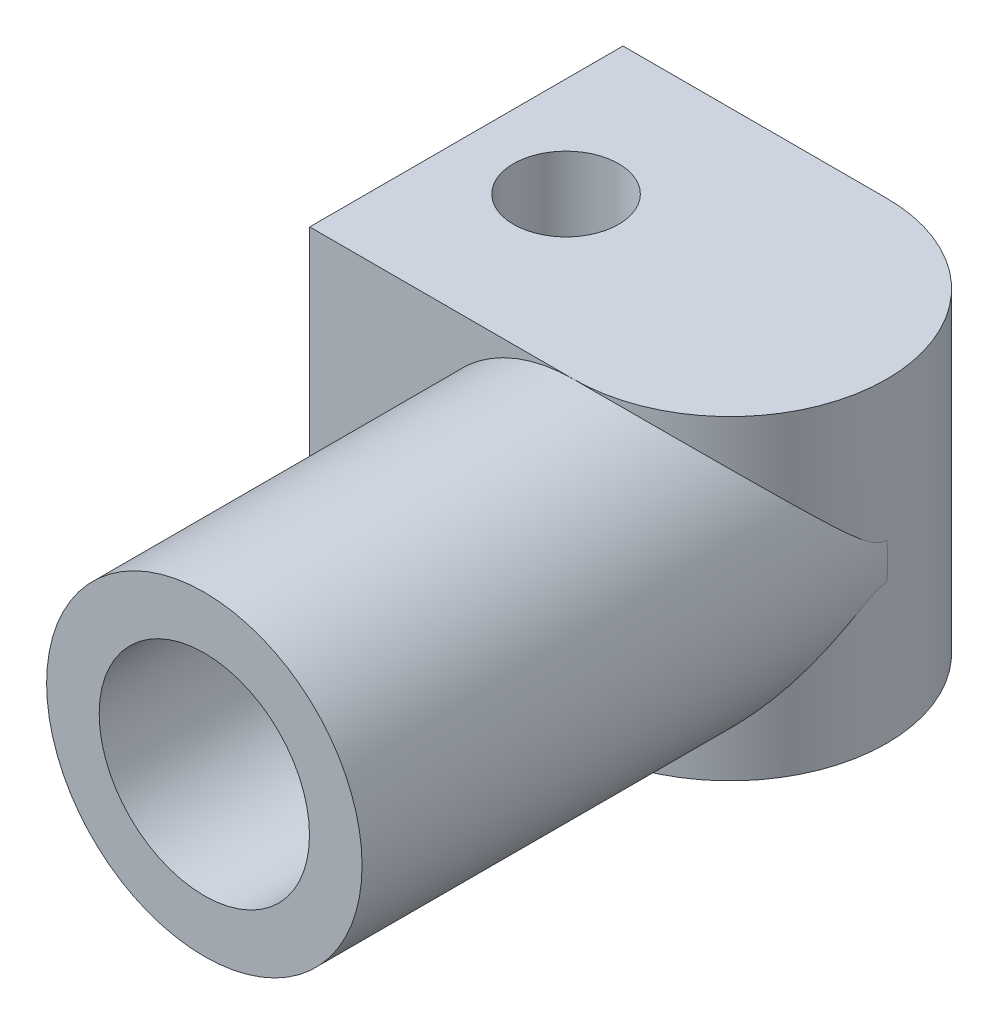
ISO-10303-21;
HEADER;
FILE_DESCRIPTION(('STEP AP214'),'2;1');
FILE_NAME('part.step','',(''),(''),'','','');
FILE_SCHEMA(('AUTOMOTIVE_DESIGN { 1 0 10303 214 1 1 1 1 }'));
ENDSEC;
DATA;
#1=APPLICATION_CONTEXT('core data for automotive mechanical design processes');
#2=APPLICATION_PROTOCOL_DEFINITION('international standard','automotive_design',2000,#1);
#3=PRODUCT_CONTEXT('',#1,'mechanical');
#4=PRODUCT('Part','Part','',(#3));
#5=PRODUCT_RELATED_PRODUCT_CATEGORY('part','',(#4));
#6=PRODUCT_DEFINITION_FORMATION('','',#4);
#7=PRODUCT_DEFINITION_CONTEXT('part definition',#1,'design');
#8=PRODUCT_DEFINITION('design','',#6,#7);
#9=PRODUCT_DEFINITION_SHAPE('','',#8);
#10=(LENGTH_UNIT() NAMED_UNIT(*) SI_UNIT(.MILLI.,.METRE.));
#11=(NAMED_UNIT(*) PLANE_ANGLE_UNIT() SI_UNIT($,.RADIAN.));
#12=(NAMED_UNIT(*) SI_UNIT($,.STERADIAN.) SOLID_ANGLE_UNIT());
#13=UNCERTAINTY_MEASURE_WITH_UNIT(LENGTH_MEASURE(1.E-05),#10,'distance_accuracy_value','');
#14=(GEOMETRIC_REPRESENTATION_CONTEXT(3) GLOBAL_UNCERTAINTY_ASSIGNED_CONTEXT((#13)) GLOBAL_UNIT_ASSIGNED_CONTEXT((#10,
#11,#12)) REPRESENTATION_CONTEXT('',''));
#15=CARTESIAN_POINT('',(0.,0.,0.));
#16=DIRECTION('',(0.,0.,1.));
#17=DIRECTION('',(1.,0.,0.));
#18=AXIS2_PLACEMENT_3D('',#15,#16,#17);
#19=CARTESIAN_POINT('',(0.,0.,0.));
#20=DIRECTION('',(0.,0.,1.));
#21=DIRECTION('',(1.,0.,0.));
#22=AXIS2_PLACEMENT_3D('',#19,#20,#21);
#23=PLANE('',#22);
#24=DIRECTION('',(0.,-1.,0.));
#25=VECTOR('',#24,1.);
#26=CARTESIAN_POINT('',(7.44939263120047,7.49999999999999,0.));
#27=LINE('',#26,#25);
#28=CARTESIAN_POINT('',(7.44939263120047,0.869798497478638,0.));
#29=VERTEX_POINT('',#28);
#30=CARTESIAN_POINT('',(7.44939263120047,-0.869798497478638,0.));
#31=VERTEX_POINT('',#30);
#32=EDGE_CURVE('E128',#29,#31,#27,.T.);
#33=ORIENTED_EDGE('',*,*,#32,.F.);
#34=CARTESIAN_POINT('',(0.,0.,0.));
#35=DIRECTION('',(0.,0.,1.));
#36=DIRECTION('',(1.,0.,0.));
#37=AXIS2_PLACEMENT_3D('',#34,#35,#36);
#38=CIRCLE('',#37,7.5);
#39=EDGE_CURVE('E150',#31,#29,#38,.T.);
#40=ORIENTED_EDGE('',*,*,#39,.F.);
#41=EDGE_LOOP('',(#33,#40));
#42=FACE_BOUND('',#41,.T.);
#43=ADVANCED_FACE('F32',(#42),#23,.F.);
#44=CARTESIAN_POINT('',(0.,0.,25.));
#45=DIRECTION('',(0.,0.,-1.));
#46=DIRECTION('',(-1.,0.,0.));
#47=AXIS2_PLACEMENT_3D('',#44,#45,#46);
#48=CYLINDRICAL_SURFACE('',#47,7.5);
#49=CARTESIAN_POINT('',(0.,0.,25.));
#50=DIRECTION('',(0.,0.,1.));
#51=DIRECTION('',(1.,0.,0.));
#52=AXIS2_PLACEMENT_3D('',#49,#50,#51);
#53=CIRCLE('',#52,7.5);
#54=CARTESIAN_POINT('',(7.5,0.,25.));
#55=VERTEX_POINT('',#54);
#56=EDGE_CURVE('E151',#55,#55,#53,.T.);
#57=ORIENTED_EDGE('',*,*,#56,.F.);
#58=EDGE_LOOP('',(#57));
#59=FACE_BOUND('',#58,.T.);
#60=CARTESIAN_POINT('',(7.44939263120047,-0.869798497478638,0.));
#61=CARTESIAN_POINT('',(7.44941052399801,-0.869506202119393,0.0620150768002998));
#62=CARTESIAN_POINT('',(7.4486194011976,-0.876458894378049,0.123410309936378));
#63=CARTESIAN_POINT('',(7.44567232135742,-0.901200201573883,0.242488834547416));
#64=CARTESIAN_POINT('',(7.44354984389902,-0.918722616693978,0.300225992788767));
#65=CARTESIAN_POINT('',(7.43791369281479,-0.963308805223114,0.418024264147335));
#66=CARTESIAN_POINT('',(7.43428570718065,-0.991129058453962,0.477773531496307));
#67=CARTESIAN_POINT('',(7.42587511042982,-1.05230445409131,0.594337811312257));
#68=CARTESIAN_POINT('',(7.42109024608031,-1.08567035753296,0.651146831703112));
#69=CARTESIAN_POINT('',(7.41037192156498,-1.15658977045568,0.763608890109187));
#70=CARTESIAN_POINT('',(7.40441655431303,-1.1942162013447,0.81921298493732));
#71=CARTESIAN_POINT('',(7.39149523125058,-1.27175103642431,0.92858470016413));
#72=CARTESIAN_POINT('',(7.38453023208524,-1.31165725902116,0.982354000140307));
#73=CARTESIAN_POINT('',(7.36048579521371,-1.44279587246004,1.15368877381193));
#74=CARTESIAN_POINT('',(7.34147041865103,-1.53700252972433,1.2686935791547));
#75=CARTESIAN_POINT('',(7.29872586480588,-1.7286754808498,1.49508192048009));
#76=CARTESIAN_POINT('',(7.27499392229819,-1.82614365886287,1.60646328732619));
#77=CARTESIAN_POINT('',(7.22278491622064,-2.02280538774936,1.82693314848143));
#78=CARTESIAN_POINT('',(7.19429943531798,-2.12200171462592,1.93601718189949));
#79=CARTESIAN_POINT('',(7.13259795987054,-2.32097150578394,2.15223591026474));
#80=CARTESIAN_POINT('',(7.09938314879623,-2.42074481970522,2.2593710853541));
#81=CARTESIAN_POINT('',(6.99304547758334,-2.71874294021208,2.57690227822617));
#82=CARTESIAN_POINT('',(6.91286927176203,-2.9170237098889,2.78493732944724));
#83=CARTESIAN_POINT('',(6.73319682354899,-3.31072709098854,3.19491906849345));
#84=CARTESIAN_POINT('',(6.63371650498792,-3.5061519163565,3.39687061701567));
#85=CARTESIAN_POINT('',(6.41404489357457,-3.89357268701963,3.7954674338976));
#86=CARTESIAN_POINT('',(6.29373161457526,-4.08554063767631,3.99207307775682));
#87=CARTESIAN_POINT('',(6.03197989695374,-4.46295839762598,4.3775528421398));
#88=CARTESIAN_POINT('',(5.89053369905339,-4.64840578176702,4.56642409027149));
#89=CARTESIAN_POINT('',(5.58573098844852,-5.01054596541914,4.93458381162535));
#90=CARTESIAN_POINT('',(5.42238334805272,-5.18724227052024,5.11387612437221));
#91=CARTESIAN_POINT('',(5.07310272558936,-5.52932303861867,5.46055408864618));
#92=CARTESIAN_POINT('',(4.88718313465489,-5.69471411844303,5.62794670727167));
#93=CARTESIAN_POINT('',(4.43168973784759,-6.05962302573749,5.9969531831863));
#94=CARTESIAN_POINT('',(4.153860572821,-6.25424513466281,6.19351531857002));
#95=CARTESIAN_POINT('',(3.70784511091356,-6.52165318823802,6.4634011978954));
#96=CARTESIAN_POINT('',(3.5543285172572,-6.60668703724063,6.54918884488847));
#97=CARTESIAN_POINT('',(3.23777297314938,-6.76744311745729,6.71132244574058));
#98=CARTESIAN_POINT('',(3.07473964328445,-6.84317076446531,6.78767389119602));
#99=CARTESIAN_POINT('',(2.76696642928773,-6.97259342387015,6.91813307648361));
#100=CARTESIAN_POINT('',(2.62356553033323,-7.0278685654626,6.97383877392842));
#101=CARTESIAN_POINT('',(2.33104380339393,-7.13023322696622,7.07698499764614));
#102=CARTESIAN_POINT('',(2.18192575689098,-7.1773266672338,7.12442948239887));
#103=CARTESIAN_POINT('',(1.87865570610499,-7.26260678856713,7.2103352690769));
#104=CARTESIAN_POINT('',(1.72450462555218,-7.30079509366389,7.24879820896984));
#105=CARTESIAN_POINT('',(1.41206237400327,-7.36760452787999,7.3160824892179));
#106=CARTESIAN_POINT('',(1.25377116972697,-7.3962255800679,7.34490375204315));
#107=CARTESIAN_POINT('',(0.933300455103316,-7.44347517300523,7.39248138699235));
#108=CARTESIAN_POINT('',(0.771104476660176,-7.46204850693424,7.41118215262372));
#109=CARTESIAN_POINT('',(0.444965139541457,-7.48857605154367,7.43789111757393));
#110=CARTESIAN_POINT('',(0.281021777001704,-7.49653023873593,7.44589929324219));
#111=CARTESIAN_POINT('',(-0.0471735777537239,-7.50164681785903,7.45105064009327));
#112=CARTESIAN_POINT('',(-0.211425506903444,-7.49881121646902,7.44819583156814));
#113=CARTESIAN_POINT('',(-0.538839065498273,-7.4824138025897,7.43168674077784));
#114=CARTESIAN_POINT('',(-0.702000748572654,-7.46885252167296,7.418032993716));
#115=CARTESIAN_POINT('',(-1.01152298394762,-7.43296088576217,7.38189420792316));
#116=CARTESIAN_POINT('',(-1.15809197965401,-7.41151330231556,7.36029817468405));
#117=CARTESIAN_POINT('',(-1.44832584054167,-7.36030399108668,7.30873002914708));
#118=CARTESIAN_POINT('',(-1.59198959877815,-7.33053915599257,7.27875478638844));
#119=CARTESIAN_POINT('',(-1.87554729138754,-7.26316455214698,7.21089635543524));
#120=CARTESIAN_POINT('',(-2.01544128884011,-7.22555491475528,7.17301329965555));
#121=CARTESIAN_POINT('',(-2.29082068455701,-7.1430256630662,7.08987245731713));
#122=CARTESIAN_POINT('',(-2.42630519456972,-7.09810458674844,7.04461319578461));
#123=CARTESIAN_POINT('',(-2.73349271402319,-6.98658177698082,6.93223179421553));
#124=CARTESIAN_POINT('',(-2.90344071850298,-6.91757115245774,6.86267675279571));
#125=CARTESIAN_POINT('',(-3.23402982535188,-6.76933702105386,6.71323049662055));
#126=CARTESIAN_POINT('',(-3.39466858746092,-6.69011096210893,6.63333669897422));
#127=CARTESIAN_POINT('',(-3.86223440620486,-6.43880990603668,6.37982954433797));
#128=CARTESIAN_POINT('',(-4.15465463295672,-6.25317066479342,6.19244947633853));
#129=CARTESIAN_POINT('',(-4.61133188944095,-5.91929966738186,5.85507824421633));
#130=CARTESIAN_POINT('',(-4.78658875465406,-5.77820129254612,5.71240597939065));
#131=CARTESIAN_POINT('',(-5.11901055527425,-5.48586113044903,5.41651600644158));
#132=CARTESIAN_POINT('',(-5.27616858959218,-5.33461550859817,5.26329431116555));
#133=CARTESIAN_POINT('',(-5.57310193673755,-5.02363383529654,4.94783353054469));
#134=CARTESIAN_POINT('',(-5.71283226092801,-4.86387726929764,4.7855726099653));
#135=CARTESIAN_POINT('',(-5.97503053318002,-4.53792379788852,4.45388979893574));
#136=CARTESIAN_POINT('',(-6.09750128391701,-4.37172794371549,4.28446907694286));
#137=CARTESIAN_POINT('',(-6.3658169531105,-3.97517405025394,3.87915558953455));
#138=CARTESIAN_POINT('',(-6.50483476098724,-3.74272275909666,3.64075616363161));
#139=CARTESIAN_POINT('',(-6.69164977898551,-3.38962981694375,3.27626710016363));
#140=CARTESIAN_POINT('',(-6.75033544323347,-3.27111381168157,3.15353634669377));
#141=CARTESIAN_POINT('',(-6.86058911975631,-3.03306992221504,2.90588069151381));
#142=CARTESIAN_POINT('',(-6.91215781817276,-2.9135421367366,2.78095600263031));
#143=CARTESIAN_POINT('',(-7.00812955598209,-2.67444494539941,2.52935490487704));
#144=CARTESIAN_POINT('',(-7.0525577538063,-2.55487724249203,2.40268643308402));
#145=CARTESIAN_POINT('',(-7.13458955899663,-2.31593902536739,2.1468908471761));
#146=CARTESIAN_POINT('',(-7.172191097138,-2.19656858176927,2.0177630006623));
#147=CARTESIAN_POINT('',(-7.24055540263681,-1.95947982324063,1.75669599293213));
#148=CARTESIAN_POINT('',(-7.27133098774741,-1.84175880738714,1.62476261956126));
#149=CARTESIAN_POINT('',(-7.32613684055992,-1.60989777945205,1.35646785783435));
#150=CARTESIAN_POINT('',(-7.35017192524228,-1.49575526213821,1.22010970971652));
#151=CARTESIAN_POINT('',(-7.38271583533801,-1.32277705755363,0.997865629956946));
#152=CARTESIAN_POINT('',(-7.39351075341108,-1.26080491615522,0.914768060400129));
#153=CARTESIAN_POINT('',(-7.41265749741973,-1.14281353753876,0.743901303720245));
#154=CARTESIAN_POINT('',(-7.42100813797139,-1.08679719702039,0.656129874254613));
#155=CARTESIAN_POINT('',(-7.43241048823987,-1.00515314024616,0.506131103583543));
#156=CARTESIAN_POINT('',(-7.43628860696785,-0.975830655299625,0.446027579970983));
#157=CARTESIAN_POINT('',(-7.44266644799996,-0.92593076587776,0.322411898517736));
#158=CARTESIAN_POINT('',(-7.4451748952346,-0.905298203153872,0.258924213007729));
#159=CARTESIAN_POINT('',(-7.44769269219652,-0.884265810006464,0.162267154573061));
#160=CARTESIAN_POINT('',(-7.44832404941581,-0.878914952604633,0.130195296509483));
#161=CARTESIAN_POINT('',(-7.44917683101413,-0.871647080162825,0.0654319225255653));
#162=CARTESIAN_POINT('',(-7.44939527999309,-0.869754992058538,0.0327376110199515));
#163=CARTESIAN_POINT('',(-7.44939263120047,-0.869798497478635,0.));
#164=B_SPLINE_CURVE_WITH_KNOTS('',3,(#60,#61,#62,#63,#64,#65,#66,#67,#68,#69,#70,#71,#72,#73,
#74,#75,#76,#77,#78,#79,#80,#81,#82,#83,#84,#85,#86,#87,#88,#89,#90,#91,#92,#93,#94,#95,#96,#97,
#98,#99,#100,#101,#102,#103,#104,#105,#106,#107,#108,#109,#110,#111,#112,#113,#114,#115,#116,
#117,#118,#119,#120,#121,#122,#123,#124,#125,#126,#127,#128,#129,#130,#131,#132,#133,#134,#135,
#136,#137,#138,#139,#140,#141,#142,#143,#144,#145,#146,#147,#148,#149,#150,#151,#152,#153,#154,
#155,#156,#157,#158,#159,#160,#161,#162,#163),.UNSPECIFIED.,.F.,.F.,(4,2,2,2,2,2,2,2,2,2,2,2,2,
2,2,2,2,2,2,2,2,2,2,2,2,2,2,2,2,2,2,2,2,2,2,2,2,2,2,2,2,2,2,2,2,2,2,2,2,2,2,4),(0.,
0.184691380121486,0.364914903218464,0.562498173993429,0.760469419060389,0.962576491393874,
1.1644933002802,1.61382780242188,2.063426521377,2.51382998398952,2.96412093480452,
3.85848116390442,4.75210675365362,5.65115371264382,6.55053158556305,7.4495462137366,
8.34803007121438,9.51945636522647,10.1049338511165,10.6900689853191,11.1800089255971,
11.6697134541235,12.1593286051848,12.648947693205,13.1412303355889,13.6335140668349,
14.1257062478887,14.6178740370646,15.0664632480094,15.5152202757485,15.9639697897367,
16.4128091477086,17.0004373459425,17.5882126334722,18.764287987292,19.5626601174746,
20.361335666247,21.1620320574232,21.9625982782763,23.0434320237369,23.5845877092237,
24.125691185777,24.6648442695361,25.204160503814,25.7424552725901,26.2803643724533,
26.5929144528154,26.9056158581856,27.106207189092,27.3055053683682,27.4028918550347,
27.5009774684334),.UNSPECIFIED.);
#165=CARTESIAN_POINT('',(0.,-7.5,7.44939263120047));
#166=VERTEX_POINT('',#165);
#167=EDGE_CURVE('E57',#31,#166,#164,.T.);
#168=ORIENTED_EDGE('',*,*,#167,.F.);
#169=ORIENTED_EDGE('',*,*,#39,.T.);
#170=CARTESIAN_POINT('',(-7.44939263120047,0.869798497478638,0.));
#171=CARTESIAN_POINT('',(-7.44941052399801,0.869506202119393,0.0620150768002998));
#172=CARTESIAN_POINT('',(-7.4486194011976,0.876458894378049,0.123410309936378));
#173=CARTESIAN_POINT('',(-7.44567232135742,0.901200201573883,0.242488834547416));
#174=CARTESIAN_POINT('',(-7.44354984389902,0.918722616693978,0.300225992788767));
#175=CARTESIAN_POINT('',(-7.43791369281479,0.963308805223114,0.418024264147335));
#176=CARTESIAN_POINT('',(-7.43428570718065,0.991129058453962,0.477773531496307));
#177=CARTESIAN_POINT('',(-7.42587511042982,1.05230445409131,0.594337811312257));
#178=CARTESIAN_POINT('',(-7.42109024608031,1.08567035753296,0.651146831703112));
#179=CARTESIAN_POINT('',(-7.41037192156498,1.15658977045568,0.763608890109187));
#180=CARTESIAN_POINT('',(-7.40441655431303,1.1942162013447,0.81921298493732));
#181=CARTESIAN_POINT('',(-7.39149523125058,1.27175103642431,0.92858470016413));
#182=CARTESIAN_POINT('',(-7.38453023208524,1.31165725902116,0.982354000140307));
#183=CARTESIAN_POINT('',(-7.36048579521371,1.44279587246004,1.15368877381193));
#184=CARTESIAN_POINT('',(-7.34147041865103,1.53700252972433,1.2686935791547));
#185=CARTESIAN_POINT('',(-7.29872586480588,1.7286754808498,1.49508192048009));
#186=CARTESIAN_POINT('',(-7.27499392229819,1.82614365886287,1.60646328732619));
#187=CARTESIAN_POINT('',(-7.22278491622064,2.02280538774936,1.82693314848143));
#188=CARTESIAN_POINT('',(-7.19429943531798,2.12200171462592,1.93601718189949));
#189=CARTESIAN_POINT('',(-7.13259795987054,2.32097150578394,2.15223591026474));
#190=CARTESIAN_POINT('',(-7.09938314879623,2.42074481970522,2.2593710853541));
#191=CARTESIAN_POINT('',(-6.99304547758334,2.71874294021208,2.57690227822617));
#192=CARTESIAN_POINT('',(-6.91286927176203,2.9170237098889,2.78493732944724));
#193=CARTESIAN_POINT('',(-6.73319682354899,3.31072709098854,3.19491906849345));
#194=CARTESIAN_POINT('',(-6.63371650498792,3.5061519163565,3.39687061701567));
#195=CARTESIAN_POINT('',(-6.41404489357457,3.89357268701963,3.7954674338976));
#196=CARTESIAN_POINT('',(-6.29373161457526,4.08554063767631,3.99207307775682));
#197=CARTESIAN_POINT('',(-6.03197989695374,4.46295839762598,4.3775528421398));
#198=CARTESIAN_POINT('',(-5.89053369905339,4.64840578176702,4.56642409027149));
#199=CARTESIAN_POINT('',(-5.58573098844852,5.01054596541914,4.93458381162535));
#200=CARTESIAN_POINT('',(-5.42238334805272,5.18724227052024,5.11387612437221));
#201=CARTESIAN_POINT('',(-5.07310272558936,5.52932303861867,5.46055408864618));
#202=CARTESIAN_POINT('',(-4.88718313465489,5.69471411844303,5.62794670727167));
#203=CARTESIAN_POINT('',(-4.43168973784759,6.05962302573749,5.9969531831863));
#204=CARTESIAN_POINT('',(-4.153860572821,6.25424513466281,6.19351531857002));
#205=CARTESIAN_POINT('',(-3.70784511091356,6.52165318823802,6.4634011978954));
#206=CARTESIAN_POINT('',(-3.5543285172572,6.60668703724063,6.54918884488847));
#207=CARTESIAN_POINT('',(-3.23777297314938,6.76744311745729,6.71132244574058));
#208=CARTESIAN_POINT('',(-3.07473964328445,6.84317076446531,6.78767389119602));
#209=CARTESIAN_POINT('',(-2.76696642928773,6.97259342387015,6.91813307648361));
#210=CARTESIAN_POINT('',(-2.62356553033323,7.0278685654626,6.97383877392842));
#211=CARTESIAN_POINT('',(-2.33104380339393,7.13023322696622,7.07698499764614));
#212=CARTESIAN_POINT('',(-2.18192575689098,7.1773266672338,7.12442948239887));
#213=CARTESIAN_POINT('',(-1.87865570610499,7.26260678856713,7.2103352690769));
#214=CARTESIAN_POINT('',(-1.72450462555218,7.30079509366389,7.24879820896984));
#215=CARTESIAN_POINT('',(-1.41206237400327,7.36760452787999,7.3160824892179));
#216=CARTESIAN_POINT('',(-1.25377116972697,7.3962255800679,7.34490375204315));
#217=CARTESIAN_POINT('',(-0.933300455103316,7.44347517300523,7.39248138699235));
#218=CARTESIAN_POINT('',(-0.771104476660176,7.46204850693424,7.41118215262372));
#219=CARTESIAN_POINT('',(-0.444965139541457,7.48857605154367,7.43789111757393));
#220=CARTESIAN_POINT('',(-0.281021777001704,7.49653023873593,7.44589929324219));
#221=CARTESIAN_POINT('',(0.0471735777537239,7.50164681785903,7.45105064009327));
#222=CARTESIAN_POINT('',(0.211425506903444,7.49881121646902,7.44819583156814));
#223=CARTESIAN_POINT('',(0.538839065498273,7.4824138025897,7.43168674077784));
#224=CARTESIAN_POINT('',(0.702000748572654,7.46885252167296,7.418032993716));
#225=CARTESIAN_POINT('',(1.01152298394762,7.43296088576217,7.38189420792316));
#226=CARTESIAN_POINT('',(1.15809197965401,7.41151330231556,7.36029817468405));
#227=CARTESIAN_POINT('',(1.44832584054167,7.36030399108668,7.30873002914708));
#228=CARTESIAN_POINT('',(1.59198959877815,7.33053915599257,7.27875478638844));
#229=CARTESIAN_POINT('',(1.87554729138754,7.26316455214698,7.21089635543524));
#230=CARTESIAN_POINT('',(2.01544128884011,7.22555491475528,7.17301329965555));
#231=CARTESIAN_POINT('',(2.29082068455701,7.1430256630662,7.08987245731713));
#232=CARTESIAN_POINT('',(2.42630519456972,7.09810458674844,7.04461319578461));
#233=CARTESIAN_POINT('',(2.73349271402319,6.98658177698082,6.93223179421553));
#234=CARTESIAN_POINT('',(2.90344071850298,6.91757115245774,6.86267675279571));
#235=CARTESIAN_POINT('',(3.23402982535188,6.76933702105386,6.71323049662055));
#236=CARTESIAN_POINT('',(3.39466858746092,6.69011096210893,6.63333669897422));
#237=CARTESIAN_POINT('',(3.86223440620486,6.43880990603668,6.37982954433797));
#238=CARTESIAN_POINT('',(4.15465463295672,6.25317066479342,6.19244947633853));
#239=CARTESIAN_POINT('',(4.61133188944095,5.91929966738186,5.85507824421633));
#240=CARTESIAN_POINT('',(4.78658875465406,5.77820129254612,5.71240597939065));
#241=CARTESIAN_POINT('',(5.11901055527425,5.48586113044903,5.41651600644158));
#242=CARTESIAN_POINT('',(5.27616858959218,5.33461550859817,5.26329431116555));
#243=CARTESIAN_POINT('',(5.57310193673755,5.02363383529654,4.94783353054469));
#244=CARTESIAN_POINT('',(5.71283226092801,4.86387726929764,4.7855726099653));
#245=CARTESIAN_POINT('',(5.97503053318002,4.53792379788852,4.45388979893574));
#246=CARTESIAN_POINT('',(6.09750128391701,4.37172794371549,4.28446907694286));
#247=CARTESIAN_POINT('',(6.3658169531105,3.97517405025394,3.87915558953455));
#248=CARTESIAN_POINT('',(6.50483476098724,3.74272275909666,3.64075616363161));
#249=CARTESIAN_POINT('',(6.69164977898551,3.38962981694375,3.27626710016363));
#250=CARTESIAN_POINT('',(6.75033544323347,3.27111381168157,3.15353634669377));
#251=CARTESIAN_POINT('',(6.86058911975631,3.03306992221504,2.90588069151381));
#252=CARTESIAN_POINT('',(6.91215781817276,2.9135421367366,2.78095600263031));
#253=CARTESIAN_POINT('',(7.00812955598209,2.67444494539941,2.52935490487704));
#254=CARTESIAN_POINT('',(7.0525577538063,2.55487724249203,2.40268643308402));
#255=CARTESIAN_POINT('',(7.13458955899663,2.31593902536739,2.1468908471761));
#256=CARTESIAN_POINT('',(7.172191097138,2.19656858176927,2.0177630006623));
#257=CARTESIAN_POINT('',(7.24055540263681,1.95947982324063,1.75669599293213));
#258=CARTESIAN_POINT('',(7.27133098774741,1.84175880738714,1.62476261956126));
#259=CARTESIAN_POINT('',(7.32613684055992,1.60989777945205,1.35646785783435));
#260=CARTESIAN_POINT('',(7.35017192524228,1.49575526213821,1.22010970971652));
#261=CARTESIAN_POINT('',(7.38271583533801,1.32277705755363,0.997865629956946));
#262=CARTESIAN_POINT('',(7.39351075341108,1.26080491615522,0.914768060400129));
#263=CARTESIAN_POINT('',(7.41265749741973,1.14281353753876,0.743901303720245));
#264=CARTESIAN_POINT('',(7.42100813797139,1.08679719702039,0.656129874254613));
#265=CARTESIAN_POINT('',(7.43241048823987,1.00515314024616,0.506131103583543));
#266=CARTESIAN_POINT('',(7.43628860696785,0.975830655299625,0.446027579970983));
#267=CARTESIAN_POINT('',(7.44266644799996,0.92593076587776,0.322411898517736));
#268=CARTESIAN_POINT('',(7.4451748952346,0.905298203153872,0.258924213007729));
#269=CARTESIAN_POINT('',(7.44769269219652,0.884265810006464,0.162267154573061));
#270=CARTESIAN_POINT('',(7.44832404941581,0.878914952604633,0.130195296509483));
#271=CARTESIAN_POINT('',(7.44917683101413,0.871647080162825,0.0654319225255653));
#272=CARTESIAN_POINT('',(7.44939527999309,0.869754992058538,0.0327376110199515));
#273=CARTESIAN_POINT('',(7.44939263120047,0.869798497478635,0.));
#274=B_SPLINE_CURVE_WITH_KNOTS('',3,(#170,#171,#172,#173,#174,#175,#176,#177,#178,#179,#180,
#181,#182,#183,#184,#185,#186,#187,#188,#189,#190,#191,#192,#193,#194,#195,#196,#197,#198,#199,
#200,#201,#202,#203,#204,#205,#206,#207,#208,#209,#210,#211,#212,#213,#214,#215,#216,#217,#218,
#219,#220,#221,#222,#223,#224,#225,#226,#227,#228,#229,#230,#231,#232,#233,#234,#235,#236,#237,
#238,#239,#240,#241,#242,#243,#244,#245,#246,#247,#248,#249,#250,#251,#252,#253,#254,#255,#256,
#257,#258,#259,#260,#261,#262,#263,#264,#265,#266,#267,#268,#269,#270,#271,#272,#273),
.UNSPECIFIED.,.F.,.F.,(4,2,2,2,2,2,2,2,2,2,2,2,2,2,2,2,2,2,2,2,2,2,2,2,2,2,2,2,2,2,2,2,2,2,2,2,
2,2,2,2,2,2,2,2,2,2,2,2,2,2,2,4),(0.,0.184691380121486,0.364914903218464,0.562498173993429,
0.760469419060389,0.962576491393874,1.1644933002802,1.61382780242188,2.063426521377,
2.51382998398952,2.96412093480452,3.85848116390442,4.75210675365362,5.65115371264382,
6.55053158556305,7.4495462137366,8.34803007121438,9.51945636522647,10.1049338511165,
10.6900689853191,11.1800089255971,11.6697134541235,12.1593286051848,12.648947693205,
13.1412303355889,13.6335140668349,14.1257062478887,14.6178740370646,15.0664632480094,
15.5152202757485,15.9639697897367,16.4128091477086,17.0004373459425,17.5882126334722,
18.764287987292,19.5626601174746,20.361335666247,21.1620320574232,21.9625982782763,
23.0434320237369,23.5845877092237,24.125691185777,24.6648442695361,25.204160503814,
25.7424552725901,26.2803643724533,26.5929144528154,26.9056158581856,27.106207189092,
27.3055053683682,27.4028918550347,27.5009774684334),.UNSPECIFIED.);
#275=CARTESIAN_POINT('',(0.,7.49999999999999,7.44939263120047));
#276=VERTEX_POINT('',#275);
#277=EDGE_CURVE('E117',#276,#29,#274,.T.);
#278=ORIENTED_EDGE('',*,*,#277,.F.);
#279=CARTESIAN_POINT('',(0.,0.,7.44939263120047));
#280=DIRECTION('',(0.,0.,-1.));
#281=DIRECTION('',(-1.,0.,0.));
#282=AXIS2_PLACEMENT_3D('',#279,#280,#281);
#283=CIRCLE('',#282,7.5);
#284=EDGE_CURVE('E53',#166,#276,#283,.T.);
#285=ORIENTED_EDGE('',*,*,#284,.F.);
#286=EDGE_LOOP('',(#168,#169,#278,#285));
#287=FACE_BOUND('',#286,.T.);
#288=ADVANCED_FACE('F34',(#59,#287),#48,.T.);
#289=CARTESIAN_POINT('',(0.,0.,25.));
#290=DIRECTION('',(0.,0.,-1.));
#291=DIRECTION('',(-1.,0.,0.));
#292=AXIS2_PLACEMENT_3D('',#289,#290,#291);
#293=CYLINDRICAL_SURFACE('',#292,5.);
#294=CARTESIAN_POINT('',(0.,0.,25.));
#295=DIRECTION('',(0.,0.,1.));
#296=DIRECTION('',(1.,0.,0.));
#297=AXIS2_PLACEMENT_3D('',#294,#295,#296);
#298=CIRCLE('',#297,5.);
#299=CARTESIAN_POINT('',(5.,0.,25.));
#300=VERTEX_POINT('',#299);
#301=EDGE_CURVE('E147',#300,#300,#298,.T.);
#302=ORIENTED_EDGE('',*,*,#301,.T.);
#303=EDGE_LOOP('',(#302));
#304=FACE_BOUND('',#303,.T.);
#305=CARTESIAN_POINT('',(0.,0.,7.44939263120047));
#306=DIRECTION('',(0.,0.,-1.));
#307=DIRECTION('',(-1.,0.,0.));
#308=AXIS2_PLACEMENT_3D('',#305,#306,#307);
#309=CIRCLE('',#308,5.);
#310=CARTESIAN_POINT('',(0.,-5.,7.44939263120047));
#311=VERTEX_POINT('',#310);
#312=CARTESIAN_POINT('',(0.,5.,7.44939263120047));
#313=VERTEX_POINT('',#312);
#314=EDGE_CURVE('E46',#311,#313,#309,.T.);
#315=ORIENTED_EDGE('',*,*,#314,.T.);
#316=CARTESIAN_POINT('',(-5.,0.,5.52208751956938));
#317=CARTESIAN_POINT('',(-5.00000363801536,0.121786871944937,5.52208111613021));
#318=CARTESIAN_POINT('',(-4.99554386385986,0.243543207178995,5.52613134382563));
#319=CARTESIAN_POINT('',(-4.97781390977846,0.485932436612291,5.54210867198933));
#320=CARTESIAN_POINT('',(-4.96454115026109,0.606564991390669,5.55403807871531));
#321=CARTESIAN_POINT('',(-4.92943105220798,0.845782796594067,5.58522205530951));
#322=CARTESIAN_POINT('',(-4.90758130978985,0.964364821100705,5.60448723282609));
#323=CARTESIAN_POINT('',(-4.85571788458222,1.19850106984403,5.64948056279092));
#324=CARTESIAN_POINT('',(-4.82569994155195,1.31405367946965,5.67521208731698));
#325=CARTESIAN_POINT('',(-4.72476349327022,1.65277286251168,5.76001073562054));
#326=CARTESIAN_POINT('',(-4.64255364150582,1.87067681855152,5.82707045808739));
#327=CARTESIAN_POINT('',(-4.45120977828511,2.28906679465806,5.97450863768228));
#328=CARTESIAN_POINT('',(-4.34207093671224,2.48954968126323,6.05488948330256));
#329=CARTESIAN_POINT('',(-4.07979274598137,2.9024328494221,6.23520968838662));
#330=CARTESIAN_POINT('',(-3.92242402861374,3.1117013000392,6.33623153626875));
#331=CARTESIAN_POINT('',(-3.66337268276536,3.4054039316706,6.48715796908165));
#332=CARTESIAN_POINT('',(-3.57310911402117,3.50000457796598,6.53740500863546));
#333=CARTESIAN_POINT('',(-3.38506365262292,3.68218392885459,6.6367224402032));
#334=CARTESIAN_POINT('',(-3.28728022091654,3.76976118847428,6.68579258863842));
#335=CARTESIAN_POINT('',(-3.0694805712895,3.94982239117111,6.78883801714208));
#336=CARTESIAN_POINT('',(-2.94831430128496,4.04111877587309,6.84246650399364));
#337=CARTESIAN_POINT('',(-2.69695819434523,4.21302554435441,6.94537962047557));
#338=CARTESIAN_POINT('',(-2.56677224739766,4.29364049164874,6.99466610213947));
#339=CARTESIAN_POINT('',(-2.29803926518416,4.44327023066615,7.08750032403638));
#340=CARTESIAN_POINT('',(-2.15949705986321,4.51229163780359,7.13105133391391));
#341=CARTESIAN_POINT('',(-1.87489039879972,4.63777491057183,7.21110750412328));
#342=CARTESIAN_POINT('',(-1.72882759136515,4.69423951399788,7.24761420011656));
#343=CARTESIAN_POINT('',(-1.44729349124722,4.78798443489059,7.30870244829151));
#344=CARTESIAN_POINT('',(-1.31249542828677,4.82671300639703,7.33416620344172));
#345=CARTESIAN_POINT('',(-1.03901992009177,4.89287420553114,7.37787573051496));
#346=CARTESIAN_POINT('',(-0.900343254052177,4.92030908485188,7.39612294121643));
#347=CARTESIAN_POINT('',(-0.620511577025817,4.96336435177585,7.42483529018574));
#348=CARTESIAN_POINT('',(-0.479359198152269,4.97899659081901,7.43530823468528));
#349=CARTESIAN_POINT('',(-0.195876346299787,4.99818021236003,7.44816781284848));
#350=CARTESIAN_POINT('',(-0.0535460462135736,5.00173333735012,7.4505556128476));
#351=CARTESIAN_POINT('',(0.20881269519235,4.99708513941714,7.44743659233617));
#352=CARTESIAN_POINT('',(0.328890461052676,4.99061450056697,7.44309211443695));
#353=CARTESIAN_POINT('',(0.567963837054991,4.96908691907471,7.42867491787307));
#354=CARTESIAN_POINT('',(0.686959121039896,4.95402747031021,7.41860052728385));
#355=CARTESIAN_POINT('',(0.922942242174013,4.91553268232572,7.39294969217309));
#356=CARTESIAN_POINT('',(1.03993074795149,4.89210019200598,7.37737511909184));
#357=CARTESIAN_POINT('',(1.27119724014276,4.83716943320744,7.34106534654178));
#358=CARTESIAN_POINT('',(1.38547415625962,4.80566803585151,7.32032814525026));
#359=CARTESIAN_POINT('',(1.72201933357627,4.69996175009858,7.25122122766447));
#360=CARTESIAN_POINT('',(1.93938142052638,4.61432415744208,7.19579884719879));
#361=CARTESIAN_POINT('',(2.35649687474311,4.41592665447724,7.0702178368779));
#362=CARTESIAN_POINT('',(2.55624709176518,4.30316190531497,7.00005657823289));
#363=CARTESIAN_POINT('',(2.9609598330101,4.03718137596045,6.83955853045835));
#364=CARTESIAN_POINT('',(3.16312732308042,3.8805902862984,6.74778097049195));
#365=CARTESIAN_POINT('',(3.5401140366179,3.54009402258141,6.557870375733));
#366=CARTESIAN_POINT('',(3.71489010193236,3.35614661689089,6.45972764912878));
#367=CARTESIAN_POINT('',(3.9675619897396,3.04629873667039,6.3058471369534));
#368=CARTESIAN_POINT('',(4.05528701360096,2.92852478391749,6.24963569403469));
#369=CARTESIAN_POINT('',(4.22044964931428,2.68504651241968,6.13931038667321));
#370=CARTESIAN_POINT('',(4.2978849093575,2.55934039036299,6.08519700375374));
#371=CARTESIAN_POINT('',(4.51372706687623,2.17111294858598,5.9288365794984));
#372=CARTESIAN_POINT('',(4.63616687415471,1.89687745019969,5.83225162197238));
#373=CARTESIAN_POINT('',(4.80342672203052,1.40490227169559,5.69463243964595));
#374=CARTESIAN_POINT('',(4.860440004719,1.19355907693841,5.64561074113649));
#375=CARTESIAN_POINT('',(4.92503275574662,0.869595870808066,5.58912191693828));
#376=CARTESIAN_POINT('',(4.94307341724375,0.760485564999606,5.57313528662782));
#377=CARTESIAN_POINT('',(4.97192395893866,0.540601304445609,5.54741457971054));
#378=CARTESIAN_POINT('',(4.98273650013168,0.429827977305742,5.53767820215786));
#379=CARTESIAN_POINT('',(4.99697353346294,0.20687286453983,5.52483461972014));
#380=CARTESIAN_POINT('',(5.00036142000498,0.0946868309483679,5.52176026125747));
#381=CARTESIAN_POINT('',(4.99957750653499,-0.129636301203009,5.52247007722672));
#382=CARTESIAN_POINT('',(4.99540570506136,-0.241773399753459,5.52625425298467));
#383=CARTESIAN_POINT('',(4.97957732993198,-0.465130731955172,5.54052105631885));
#384=CARTESIAN_POINT('',(4.96791784224597,-0.576350591563209,5.55100629178123));
#385=CARTESIAN_POINT('',(4.93732500870196,-0.797026297299438,5.57823296182711));
#386=CARTESIAN_POINT('',(4.91838867147992,-0.906481398665754,5.59497696918638));
#387=CARTESIAN_POINT('',(4.85350292717463,-1.21949828825523,5.65156392091088));
#388=CARTESIAN_POINT('',(4.7985226803383,-1.41994580361688,5.69869065764622));
#389=CARTESIAN_POINT('',(4.6658774954272,-1.80885111038956,5.80778280271874));
#390=CARTESIAN_POINT('',(4.58819498328081,-1.99729947496966,5.86975970000781));
#391=CARTESIAN_POINT('',(4.43554702198694,-2.31256497931741,5.98548065230455));
#392=CARTESIAN_POINT('',(4.3652923357452,-2.44250489941374,6.03706974111032));
#393=CARTESIAN_POINT('',(4.21426246290672,-2.69473555215345,6.14344920319075));
#394=CARTESIAN_POINT('',(4.13348720994735,-2.81702623653906,6.19823959665771));
#395=CARTESIAN_POINT('',(3.96176230968894,-3.0538284952513,6.30938757840938));
#396=CARTESIAN_POINT('',(3.87079554641279,-3.16832644783628,6.36574767996535));
#397=CARTESIAN_POINT('',(3.67917359309478,-3.388956983013,6.47838593386448));
#398=CARTESIAN_POINT('',(3.57851817264757,-3.49508936655443,6.53466408422645));
#399=CARTESIAN_POINT('',(3.36697220729664,-3.6993643898894,6.64615404940585));
#400=CARTESIAN_POINT('',(3.25600318540087,-3.79743287938462,6.7013530290442));
#401=CARTESIAN_POINT('',(3.02496300085191,-3.98392071593164,6.80876414540979));
#402=CARTESIAN_POINT('',(2.90489592960641,-4.07234435715594,6.86097760641112));
#403=CARTESIAN_POINT('',(2.65625392413151,-4.23870926849178,6.96101264961478));
#404=CARTESIAN_POINT('',(2.52769174008894,-4.31666573835721,7.00884056748118));
#405=CARTESIAN_POINT('',(2.26254112365419,-4.46135619828831,7.09886907709387));
#406=CARTESIAN_POINT('',(2.12595505034458,-4.52809346481928,7.14107131102143));
#407=CARTESIAN_POINT('',(1.87609501067635,-4.63622282889304,7.21017916963155));
#408=CARTESIAN_POINT('',(1.76420323335111,-4.67997130634473,7.23841612199742));
#409=CARTESIAN_POINT('',(1.53658127784244,-4.75956372527784,7.29012901882757));
#410=CARTESIAN_POINT('',(1.42085184216217,-4.79540918567351,7.31360587808442));
#411=CARTESIAN_POINT('',(1.18623151736284,-4.85876692422187,7.35530405625227));
#412=CARTESIAN_POINT('',(1.06734138470522,-4.88628117712642,7.37352662054345));
#413=CARTESIAN_POINT('',(0.827207362831333,-4.93261311133672,7.40431108811692));
#414=CARTESIAN_POINT('',(0.705964575557669,-4.95143476632051,7.41687557782924));
#415=CARTESIAN_POINT('',(0.461500165480842,-4.98018273935928,7.43609815035863));
#416=CARTESIAN_POINT('',(0.338272860219927,-4.99007571472492,7.44273409306462));
#417=CARTESIAN_POINT('',(0.0912907874407591,-5.00069377890865,7.44985726539658));
#418=CARTESIAN_POINT('',(-0.0324637679849378,-5.00142225940405,7.45034676975068));
#419=CARTESIAN_POINT('',(-0.279586342049201,-4.9937077912825,7.44517024127715));
#420=CARTESIAN_POINT('',(-0.402954259214695,-4.98526260909858,7.43950270935873));
#421=CARTESIAN_POINT('',(-0.648300768193289,-4.95932701879872,7.42214811288872));
#422=CARTESIAN_POINT('',(-0.770279391718339,-4.94183681756853,7.41046118601813));
#423=CARTESIAN_POINT('',(-1.00572713553524,-4.89919163189591,7.38209243269688));
#424=CARTESIAN_POINT('',(-1.11931117113804,-4.87447731930087,7.36569854367832));
#425=CARTESIAN_POINT('',(-1.34374920009203,-4.81744372965047,7.32808027314637));
#426=CARTESIAN_POINT('',(-1.45460229307236,-4.78512198058831,7.30685432154675));
#427=CARTESIAN_POINT('',(-1.7820687694041,-4.67728054400585,7.23653185407652));
#428=CARTESIAN_POINT('',(-1.99377213965624,-4.59085088747721,7.18076775611337));
#429=CARTESIAN_POINT('',(-2.41657306778682,-4.38407023605622,7.05028883151583));
#430=CARTESIAN_POINT('',(-2.62622180325254,-4.26153255293721,6.97440181611267));
#431=CARTESIAN_POINT('',(-3.02296676158092,-3.98993208489806,6.81184027393571));
#432=CARTESIAN_POINT('',(-3.21004502692922,-3.84084840990081,6.72515726763993));
#433=CARTESIAN_POINT('',(-3.58876979856368,-3.49247626962226,6.53195145142165));
#434=CARTESIAN_POINT('',(-3.77609901554592,-3.28896323030033,6.42451163016033));
#435=CARTESIAN_POINT('',(-4.0304883234449,-2.96213427310801,6.26567506973249));
#436=CARTESIAN_POINT('',(-4.11089219540989,-2.84952164537223,6.21308490710403));
#437=CARTESIAN_POINT('',(-4.26248852114565,-2.61733260313037,6.11007611894185));
#438=CARTESIAN_POINT('',(-4.33368141605796,-2.49775652252315,6.05965738948885));
#439=CARTESIAN_POINT('',(-4.51347756608572,-2.16459492000178,5.92804229865691));
#440=CARTESIAN_POINT('',(-4.61286627357779,-1.94440729933351,5.85033785170726));
#441=CARTESIAN_POINT('',(-4.73813543864255,-1.60152003085166,5.7486028794732));
#442=CARTESIAN_POINT('',(-4.77590397359774,-1.48521263536453,5.71717901921344));
#443=CARTESIAN_POINT('',(-4.8431008264285,-1.24878565721832,5.66036680410502));
#444=CARTESIAN_POINT('',(-4.87253207773887,-1.12866743196459,5.63497632694639));
#445=CARTESIAN_POINT('',(-4.93124192042876,-0.843096651277554,5.58375658131825));
#446=CARTESIAN_POINT('',(-4.95693517913399,-0.676355300457205,5.56082275243131));
#447=CARTESIAN_POINT('',(-4.99131019284914,-0.339722467685186,5.52999400309931));
#448=CARTESIAN_POINT('',(-4.99999492679505,-0.169831542624258,5.52209644915214));
#449=CARTESIAN_POINT('',(-5.,0.,5.52208751956938));
#450=B_SPLINE_CURVE_WITH_KNOTS('',3,(#316,#317,#318,#319,#320,#321,#322,#323,#324,#325,#326,
#327,#328,#329,#330,#331,#332,#333,#334,#335,#336,#337,#338,#339,#340,#341,#342,#343,#344,#345,
#346,#347,#348,#349,#350,#351,#352,#353,#354,#355,#356,#357,#358,#359,#360,#361,#362,#363,#364,
#365,#366,#367,#368,#369,#370,#371,#372,#373,#374,#375,#376,#377,#378,#379,#380,#381,#382,#383,
#384,#385,#386,#387,#388,#389,#390,#391,#392,#393,#394,#395,#396,#397,#398,#399,#400,#401,#402,
#403,#404,#405,#406,#407,#408,#409,#410,#411,#412,#413,#414,#415,#416,#417,#418,#419,#420,#421,
#422,#423,#424,#425,#426,#427,#428,#429,#430,#431,#432,#433,#434,#435,#436,#437,#438,#439,#440,
#441,#442,#443,#444,#445,#446,#447,#448,#449),.UNSPECIFIED.,.T.,.F.,(4,2,2,2,2,2,2,2,2,2,2,2,2,
2,2,2,2,2,2,2,2,2,2,2,2,2,2,2,2,2,2,2,2,2,2,2,2,2,2,2,2,2,2,2,2,2,2,2,2,2,2,2,2,2,2,2,2,2,2,2,2,
2,2,2,2,2,4),(0.,0.365161480167903,0.730429891516087,1.09622850537293,1.46221827358511,
2.18609920664097,2.91011007305991,3.7486542512747,4.16858750147059,4.58860692718892,
5.07069831635949,5.55258306907349,6.03419191147189,6.51569564416176,6.9426823308766,
7.36958384534313,7.79605612100988,8.22246687261382,8.58301973652443,8.9436778597495,
9.30421338688216,9.66488893095121,10.3820676561485,11.0993744043351,11.9114050441755,
12.7247025348775,13.1959274126686,13.6672598081445,14.6074212532734,15.2775489066815,
15.6124016295448,15.9471310101161,16.2835070208316,16.6198830965823,16.9563901613378,
17.2930357055002,17.9298623946165,18.5671833699864,19.0360203552621,19.5048602980555,
19.9744997763737,20.4441504259196,20.9177243961679,21.3910866490951,21.8637539049128,
22.3362828818916,22.7061521254162,23.075950220119,23.4456605925846,23.8152017903457,
24.1861173367591,24.5568956074274,24.9277641739555,25.2986242580216,25.6504027915745,
26.0022957923895,26.7055261935583,27.4659347713605,28.2269444104642,29.1132253168275,
29.5569154898143,30.0005844052639,30.7584733895647,31.1368668066791,31.5151269219842,
32.0244330653217,32.5336499989163),.UNSPECIFIED.);
#451=EDGE_CURVE('E11',#313,#311,#450,.T.);
#452=ORIENTED_EDGE('',*,*,#451,.T.);
#453=EDGE_LOOP('',(#315,#452));
#454=FACE_BOUND('',#453,.T.);
#455=ADVANCED_FACE('F137',(#304,#454),#293,.F.);
#456=CARTESIAN_POINT('',(0.,0.,25.));
#457=DIRECTION('',(0.,0.,1.));
#458=DIRECTION('',(1.,0.,0.));
#459=AXIS2_PLACEMENT_3D('',#456,#457,#458);
#460=PLANE('',#459);
#461=ORIENTED_EDGE('',*,*,#56,.T.);
#462=EDGE_LOOP('',(#461));
#463=FACE_BOUND('',#462,.T.);
#464=ORIENTED_EDGE('',*,*,#301,.F.);
#465=EDGE_LOOP('',(#464));
#466=FACE_BOUND('',#465,.T.);
#467=ADVANCED_FACE('F206',(#463,#466),#460,.T.);
#468=CARTESIAN_POINT('',(0.,7.49999999999999,7.44939263120047));
#469=DIRECTION('',(0.,0.,-1.));
#470=DIRECTION('',(-1.,0.,0.));
#471=AXIS2_PLACEMENT_3D('',#468,#469,#470);
#472=PLANE('',#471);
#473=ORIENTED_EDGE('',*,*,#314,.F.);
#474=DIRECTION('',(0.,-1.,0.));
#475=VECTOR('',#474,1.);
#476=CARTESIAN_POINT('',(0.,7.49999999999999,7.44939263120047));
#477=LINE('',#476,#475);
#478=EDGE_CURVE('E159',#313,#311,#477,.T.);
#479=ORIENTED_EDGE('',*,*,#478,.F.);
#480=EDGE_LOOP('',(#473,#479));
#481=FACE_BOUND('',#480,.T.);
#482=ADVANCED_FACE('F134',(#481),#472,.F.);
#483=CARTESIAN_POINT('',(0.,7.49999999999999,0.));
#484=DIRECTION('',(0.,-1.,0.));
#485=DIRECTION('',(0.,0.,-1.));
#486=AXIS2_PLACEMENT_3D('',#483,#484,#485);
#487=CYLINDRICAL_SURFACE('',#486,7.44939263120047);
#488=ORIENTED_EDGE('',*,*,#451,.F.);
#489=ORIENTED_EDGE('',*,*,#478,.T.);
#490=EDGE_LOOP('',(#488,#489));
#491=FACE_BOUND('',#490,.T.);
#492=ADVANCED_FACE('F130',(#491),#487,.T.);
#493=ORIENTED_EDGE('',*,*,#32,.T.);
#494=ORIENTED_EDGE('',*,*,#167,.T.);
#495=CARTESIAN_POINT('',(0.,-7.49999999999999,0.));
#496=DIRECTION('',(0.,1.,0.));
#497=DIRECTION('',(0.,0.,1.));
#498=AXIS2_PLACEMENT_3D('',#495,#496,#497);
#499=CIRCLE('',#498,7.44939263120047);
#500=CARTESIAN_POINT('',(0.,-7.49999999999999,-7.44939263120047));
#501=VERTEX_POINT('',#500);
#502=EDGE_CURVE('E115',#166,#501,#499,.T.);
#503=ORIENTED_EDGE('',*,*,#502,.T.);
#504=DIRECTION('',(0.,-1.,0.));
#505=VECTOR('',#504,1.);
#506=CARTESIAN_POINT('',(0.,7.49999999999999,-7.44939263120047));
#507=LINE('',#506,#505);
#508=CARTESIAN_POINT('',(0.,7.49999999999999,-7.44939263120047));
#509=VERTEX_POINT('',#508);
#510=EDGE_CURVE('E94',#509,#501,#507,.T.);
#511=ORIENTED_EDGE('',*,*,#510,.F.);
#512=CARTESIAN_POINT('',(0.,7.49999999999999,0.));
#513=DIRECTION('',(0.,1.,0.));
#514=DIRECTION('',(0.,0.,1.));
#515=AXIS2_PLACEMENT_3D('',#512,#513,#514);
#516=CIRCLE('',#515,7.44939263120047);
#517=EDGE_CURVE('E101',#276,#509,#516,.T.);
#518=ORIENTED_EDGE('',*,*,#517,.F.);
#519=ORIENTED_EDGE('',*,*,#277,.T.);
#520=EDGE_LOOP('',(#493,#494,#503,#511,#518,#519));
#521=FACE_BOUND('',#520,.T.);
#522=ADVANCED_FACE('F113',(#521),#487,.T.);
#523=CARTESIAN_POINT('',(-12.5415694386262,7.49999999999999,-7.44939263120047));
#524=DIRECTION('',(0.,0.,1.));
#525=DIRECTION('',(1.,0.,0.));
#526=AXIS2_PLACEMENT_3D('',#523,#524,#525);
#527=PLANE('',#526);
#528=DIRECTION('',(-1.,0.,0.));
#529=VECTOR('',#528,1.);
#530=CARTESIAN_POINT('',(-12.5415694386262,-7.49999999999999,-7.44939263120047));
#531=LINE('',#530,#529);
#532=CARTESIAN_POINT('',(-12.5415694386262,-7.49999999999999,-7.44939263120047));
#533=VERTEX_POINT('',#532);
#534=EDGE_CURVE('E169',#501,#533,#531,.T.);
#535=ORIENTED_EDGE('',*,*,#534,.T.);
#536=DIRECTION('',(0.,-1.,0.));
#537=VECTOR('',#536,1.);
#538=CARTESIAN_POINT('',(-12.5415694386262,7.49999999999999,-7.44939263120047));
#539=LINE('',#538,#537);
#540=CARTESIAN_POINT('',(-12.5415694386262,7.49999999999999,-7.44939263120047));
#541=VERTEX_POINT('',#540);
#542=EDGE_CURVE('E97',#541,#533,#539,.T.);
#543=ORIENTED_EDGE('',*,*,#542,.F.);
#544=DIRECTION('',(-1.,0.,0.));
#545=VECTOR('',#544,1.);
#546=CARTESIAN_POINT('',(0.,7.49999999999999,-7.44939263120047));
#547=LINE('',#546,#545);
#548=EDGE_CURVE('E90',#509,#541,#547,.T.);
#549=ORIENTED_EDGE('',*,*,#548,.F.);
#550=ORIENTED_EDGE('',*,*,#510,.T.);
#551=EDGE_LOOP('',(#535,#543,#549,#550));
#552=FACE_BOUND('',#551,.T.);
#553=ADVANCED_FACE('F92',(#552),#527,.F.);
#554=CARTESIAN_POINT('',(-12.5415694386262,7.49999999999999,7.44939263120047));
#555=DIRECTION('',(1.,0.,0.));
#556=DIRECTION('',(0.,0.,-1.));
#557=AXIS2_PLACEMENT_3D('',#554,#555,#556);
#558=PLANE('',#557);
#559=DIRECTION('',(0.,0.,1.));
#560=VECTOR('',#559,1.);
#561=CARTESIAN_POINT('',(-12.5415694386262,-7.49999999999999,7.44939263120047));
#562=LINE('',#561,#560);
#563=CARTESIAN_POINT('',(-12.5415694386262,-7.49999999999999,7.44939263120047));
#564=VERTEX_POINT('',#563);
#565=EDGE_CURVE('E166',#533,#564,#562,.T.);
#566=ORIENTED_EDGE('',*,*,#565,.T.);
#567=DIRECTION('',(0.,-1.,0.));
#568=VECTOR('',#567,1.);
#569=CARTESIAN_POINT('',(-12.5415694386262,7.49999999999999,7.44939263120047));
#570=LINE('',#569,#568);
#571=CARTESIAN_POINT('',(-12.5415694386262,7.49999999999999,7.44939263120047));
#572=VERTEX_POINT('',#571);
#573=EDGE_CURVE('E119',#572,#564,#570,.T.);
#574=ORIENTED_EDGE('',*,*,#573,.F.);
#575=DIRECTION('',(0.,0.,1.));
#576=VECTOR('',#575,1.);
#577=CARTESIAN_POINT('',(-12.5415694386262,7.49999999999999,7.44939263120047));
#578=LINE('',#577,#576);
#579=EDGE_CURVE('E100',#541,#572,#578,.T.);
#580=ORIENTED_EDGE('',*,*,#579,.F.);
#581=ORIENTED_EDGE('',*,*,#542,.T.);
#582=EDGE_LOOP('',(#566,#574,#580,#581));
#583=FACE_BOUND('',#582,.T.);
#584=ADVANCED_FACE('F197',(#583),#558,.F.);
#585=DIRECTION('',(1.,0.,0.));
#586=VECTOR('',#585,1.);
#587=CARTESIAN_POINT('',(0.,-7.49999999999999,7.44939263120047));
#588=LINE('',#587,#586);
#589=EDGE_CURVE('E110',#564,#166,#588,.T.);
#590=ORIENTED_EDGE('',*,*,#589,.T.);
#591=ORIENTED_EDGE('',*,*,#284,.T.);
#592=DIRECTION('',(1.,0.,0.));
#593=VECTOR('',#592,1.);
#594=CARTESIAN_POINT('',(-9.30501079132128,7.49999999999999,7.44939263120047));
#595=LINE('',#594,#593);
#596=EDGE_CURVE('E107',#572,#276,#595,.T.);
#597=ORIENTED_EDGE('',*,*,#596,.F.);
#598=ORIENTED_EDGE('',*,*,#573,.T.);
#599=EDGE_LOOP('',(#590,#591,#597,#598));
#600=FACE_BOUND('',#599,.T.);
#601=ADVANCED_FACE('F190',(#600),#472,.F.);
#602=CARTESIAN_POINT('',(0.,7.49999999999999,0.));
#603=DIRECTION('',(0.,1.,0.));
#604=DIRECTION('',(0.,0.,1.));
#605=AXIS2_PLACEMENT_3D('',#602,#603,#604);
#606=PLANE('',#605);
#607=CARTESIAN_POINT('',(-7.8,7.49999999999999,0.));
#608=DIRECTION('',(0.,1.,0.));
#609=DIRECTION('',(0.,0.,1.));
#610=AXIS2_PLACEMENT_3D('',#607,#608,#609);
#611=CIRCLE('',#610,2.5);
#612=CARTESIAN_POINT('',(-7.8,7.49999999999999,2.5));
#613=VERTEX_POINT('',#612);
#614=EDGE_CURVE('E174',#613,#613,#611,.T.);
#615=ORIENTED_EDGE('',*,*,#614,.F.);
#616=EDGE_LOOP('',(#615));
#617=FACE_BOUND('',#616,.T.);
#618=ORIENTED_EDGE('',*,*,#517,.T.);
#619=ORIENTED_EDGE('',*,*,#548,.T.);
#620=ORIENTED_EDGE('',*,*,#579,.T.);
#621=ORIENTED_EDGE('',*,*,#596,.T.);
#622=EDGE_LOOP('',(#618,#619,#620,#621));
#623=FACE_BOUND('',#622,.T.);
#624=ADVANCED_FACE('F105',(#617,#623),#606,.T.);
#625=CARTESIAN_POINT('',(0.,-7.49999999999999,0.));
#626=DIRECTION('',(0.,1.,0.));
#627=DIRECTION('',(0.,0.,1.));
#628=AXIS2_PLACEMENT_3D('',#625,#626,#627);
#629=PLANE('',#628);
#630=CARTESIAN_POINT('',(-7.8,-7.49999999999999,0.));
#631=DIRECTION('',(0.,1.,0.));
#632=DIRECTION('',(0.,0.,1.));
#633=AXIS2_PLACEMENT_3D('',#630,#631,#632);
#634=CIRCLE('',#633,2.5);
#635=CARTESIAN_POINT('',(-7.8,-7.49999999999999,2.5));
#636=VERTEX_POINT('',#635);
#637=EDGE_CURVE('E171',#636,#636,#634,.T.);
#638=ORIENTED_EDGE('',*,*,#637,.T.);
#639=EDGE_LOOP('',(#638));
#640=FACE_BOUND('',#639,.T.);
#641=ORIENTED_EDGE('',*,*,#502,.F.);
#642=ORIENTED_EDGE('',*,*,#589,.F.);
#643=ORIENTED_EDGE('',*,*,#565,.F.);
#644=ORIENTED_EDGE('',*,*,#534,.F.);
#645=EDGE_LOOP('',(#641,#642,#643,#644));
#646=FACE_BOUND('',#645,.T.);
#647=ADVANCED_FACE('F180',(#640,#646),#629,.F.);
#648=CARTESIAN_POINT('',(-7.8,-7.49999999999999,0.));
#649=DIRECTION('',(0.,1.,0.));
#650=DIRECTION('',(0.,0.,1.));
#651=AXIS2_PLACEMENT_3D('',#648,#649,#650);
#652=CYLINDRICAL_SURFACE('',#651,2.5);
#653=ORIENTED_EDGE('',*,*,#637,.F.);
#654=EDGE_LOOP('',(#653));
#655=FACE_BOUND('',#654,.T.);
#656=ORIENTED_EDGE('',*,*,#614,.T.);
#657=EDGE_LOOP('',(#656));
#658=FACE_BOUND('',#657,.T.);
#659=ADVANCED_FACE('F183',(#655,#658),#652,.F.);
#660=CLOSED_SHELL('',(#43,#288,#455,#467,#482,#492,#522,#553,#584,#601,#624,#647,#659));
#661=MANIFOLD_SOLID_BREP('B2',#660);
#662=ADVANCED_BREP_SHAPE_REPRESENTATION('',(#18,#661),#14);
#663=SHAPE_DEFINITION_REPRESENTATION(#9,#662);
ENDSEC;
END-ISO-10303-21;
